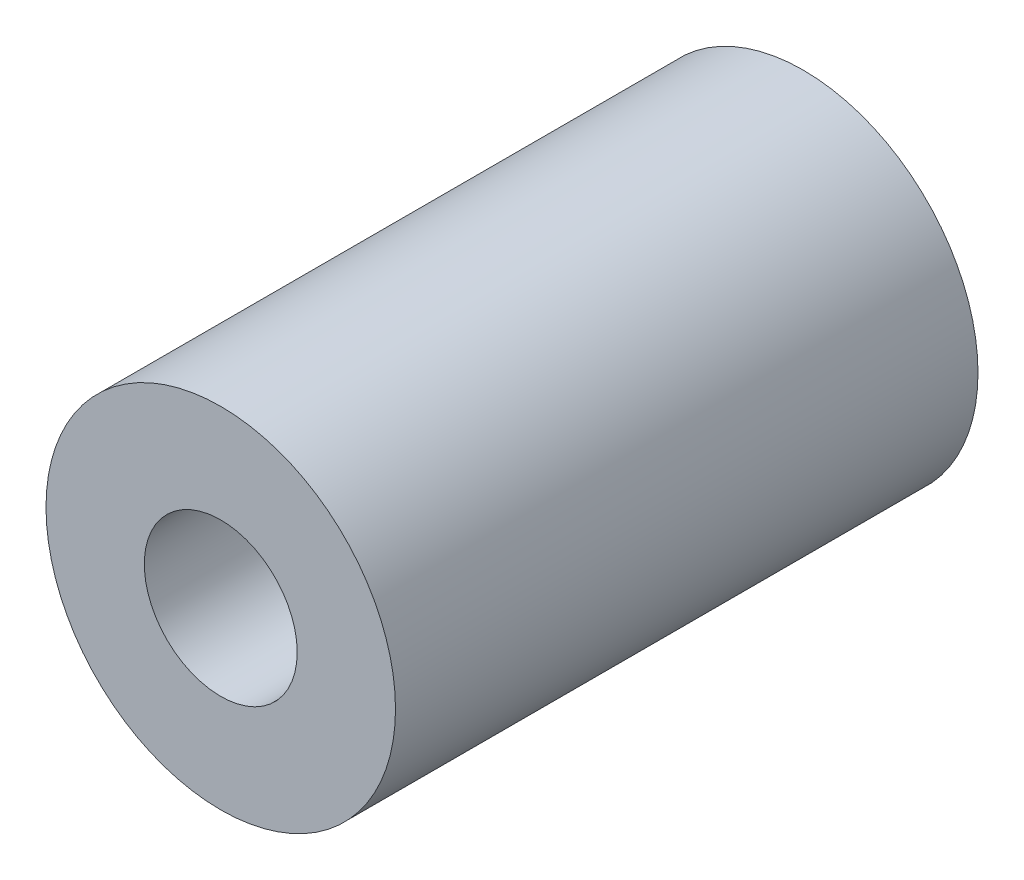
ISO-10303-21;
HEADER;
FILE_DESCRIPTION(('STEP AP214'),'2;1');
FILE_NAME('part.step','',(''),(''),'','','');
FILE_SCHEMA(('AUTOMOTIVE_DESIGN { 1 0 10303 214 1 1 1 1 }'));
ENDSEC;
DATA;
#1=APPLICATION_CONTEXT('core data for automotive mechanical design processes');
#2=APPLICATION_PROTOCOL_DEFINITION('international standard','automotive_design',2000,#1);
#3=PRODUCT_CONTEXT('',#1,'mechanical');
#4=PRODUCT('Part','Part','',(#3));
#5=PRODUCT_RELATED_PRODUCT_CATEGORY('part','',(#4));
#6=PRODUCT_DEFINITION_FORMATION('','',#4);
#7=PRODUCT_DEFINITION_CONTEXT('part definition',#1,'design');
#8=PRODUCT_DEFINITION('design','',#6,#7);
#9=PRODUCT_DEFINITION_SHAPE('','',#8);
#10=(LENGTH_UNIT() NAMED_UNIT(*) SI_UNIT(.MILLI.,.METRE.));
#11=(NAMED_UNIT(*) PLANE_ANGLE_UNIT() SI_UNIT($,.RADIAN.));
#12=(NAMED_UNIT(*) SI_UNIT($,.STERADIAN.) SOLID_ANGLE_UNIT());
#13=UNCERTAINTY_MEASURE_WITH_UNIT(LENGTH_MEASURE(1.E-05),#10,'distance_accuracy_value','');
#14=(GEOMETRIC_REPRESENTATION_CONTEXT(3) GLOBAL_UNCERTAINTY_ASSIGNED_CONTEXT((#13)) GLOBAL_UNIT_ASSIGNED_CONTEXT((#10,
#11,#12)) REPRESENTATION_CONTEXT('',''));
#15=CARTESIAN_POINT('',(0.,0.,0.));
#16=DIRECTION('',(0.,0.,1.));
#17=DIRECTION('',(1.,0.,0.));
#18=AXIS2_PLACEMENT_3D('',#15,#16,#17);
#19=CARTESIAN_POINT('',(0.,0.,-1.));
#20=DIRECTION('',(0.,0.,1.));
#21=DIRECTION('',(1.,0.,0.));
#22=AXIS2_PLACEMENT_3D('',#19,#20,#21);
#23=CYLINDRICAL_SURFACE('',#22,1.05);
#24=DIRECTION('',(0.,0.,1.));
#25=VECTOR('',#24,1.);
#26=CARTESIAN_POINT('',(1.05,0.,-1.));
#27=LINE('',#26,#25);
#28=CARTESIAN_POINT('',(1.05,0.,0.));
#29=VERTEX_POINT('',#28);
#30=CARTESIAN_POINT('',(1.05,0.,8.));
#31=VERTEX_POINT('',#30);
#32=EDGE_CURVE('E10',#29,#31,#27,.T.);
#33=ORIENTED_EDGE('',*,*,#32,.F.);
#34=CARTESIAN_POINT('',(0.,0.,0.));
#35=DIRECTION('',(0.,0.,1.));
#36=DIRECTION('',(1.,0.,0.));
#37=AXIS2_PLACEMENT_3D('',#34,#35,#36);
#38=CIRCLE('',#37,1.05);
#39=EDGE_CURVE('E24',#29,#29,#38,.T.);
#40=ORIENTED_EDGE('',*,*,#39,.F.);
#41=ORIENTED_EDGE('',*,*,#32,.T.);
#42=CARTESIAN_POINT('',(0.,0.,8.));
#43=DIRECTION('',(0.,0.,1.));
#44=DIRECTION('',(1.,0.,0.));
#45=AXIS2_PLACEMENT_3D('',#42,#43,#44);
#46=CIRCLE('',#45,1.05);
#47=EDGE_CURVE('E67',#31,#31,#46,.T.);
#48=ORIENTED_EDGE('',*,*,#47,.T.);
#49=EDGE_LOOP('',(#33,#40,#41,#48));
#50=FACE_BOUND('',#49,.T.);
#51=ADVANCED_FACE('F16',(#50),#23,.F.);
#52=CARTESIAN_POINT('',(0.,0.,0.));
#53=DIRECTION('',(0.,0.,1.));
#54=DIRECTION('',(1.,0.,0.));
#55=AXIS2_PLACEMENT_3D('',#52,#53,#54);
#56=PLANE('',#55);
#57=ORIENTED_EDGE('',*,*,#39,.T.);
#58=EDGE_LOOP('',(#57));
#59=FACE_BOUND('',#58,.T.);
#60=CARTESIAN_POINT('',(0.,0.,0.));
#61=DIRECTION('',(0.,0.,1.));
#62=DIRECTION('',(1.,0.,0.));
#63=AXIS2_PLACEMENT_3D('',#60,#61,#62);
#64=CIRCLE('',#63,2.4);
#65=CARTESIAN_POINT('',(2.4,0.,0.));
#66=VERTEX_POINT('',#65);
#67=EDGE_CURVE('E55',#66,#66,#64,.T.);
#68=ORIENTED_EDGE('',*,*,#67,.F.);
#69=EDGE_LOOP('',(#68));
#70=FACE_BOUND('',#69,.T.);
#71=ADVANCED_FACE('F73',(#59,#70),#56,.F.);
#72=CARTESIAN_POINT('',(0.,0.,8.));
#73=DIRECTION('',(0.,0.,1.));
#74=DIRECTION('',(1.,0.,0.));
#75=AXIS2_PLACEMENT_3D('',#72,#73,#74);
#76=PLANE('',#75);
#77=ORIENTED_EDGE('',*,*,#47,.F.);
#78=EDGE_LOOP('',(#77));
#79=FACE_BOUND('',#78,.T.);
#80=CARTESIAN_POINT('',(0.,0.,8.));
#81=DIRECTION('',(0.,0.,1.));
#82=DIRECTION('',(1.,0.,0.));
#83=AXIS2_PLACEMENT_3D('',#80,#81,#82);
#84=CIRCLE('',#83,2.4);
#85=CARTESIAN_POINT('',(2.4,0.,8.));
#86=VERTEX_POINT('',#85);
#87=EDGE_CURVE('E53',#86,#86,#84,.T.);
#88=ORIENTED_EDGE('',*,*,#87,.T.);
#89=EDGE_LOOP('',(#88));
#90=FACE_BOUND('',#89,.T.);
#91=ADVANCED_FACE('F59',(#79,#90),#76,.T.);
#92=CARTESIAN_POINT('',(0.,0.,0.));
#93=DIRECTION('',(0.,0.,1.));
#94=DIRECTION('',(1.,0.,0.));
#95=AXIS2_PLACEMENT_3D('',#92,#93,#94);
#96=CYLINDRICAL_SURFACE('',#95,2.4);
#97=ORIENTED_EDGE('',*,*,#87,.F.);
#98=DIRECTION('',(0.,0.,1.));
#99=VECTOR('',#98,1.);
#100=CARTESIAN_POINT('',(2.4,0.,0.));
#101=LINE('',#100,#99);
#102=EDGE_CURVE('E50',#66,#86,#101,.T.);
#103=ORIENTED_EDGE('',*,*,#102,.F.);
#104=ORIENTED_EDGE('',*,*,#67,.T.);
#105=ORIENTED_EDGE('',*,*,#102,.T.);
#106=EDGE_LOOP('',(#97,#103,#104,#105));
#107=FACE_BOUND('',#106,.T.);
#108=ADVANCED_FACE('F52',(#107),#96,.T.);
#109=CLOSED_SHELL('',(#51,#71,#91,#108));
#110=MANIFOLD_SOLID_BREP('B1',#109);
#111=ADVANCED_BREP_SHAPE_REPRESENTATION('',(#18,#110),#14);
#112=SHAPE_DEFINITION_REPRESENTATION(#9,#111);
ENDSEC;
END-ISO-10303-21;
